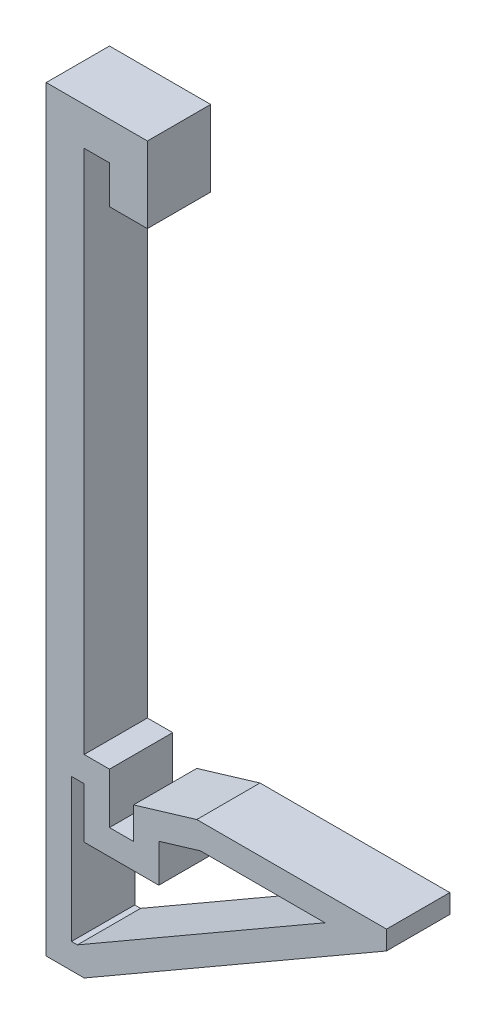
ISO-10303-21;
HEADER;
FILE_DESCRIPTION(('STEP AP214'),'2;1');
FILE_NAME('part.step','',(''),(''),'','','');
FILE_SCHEMA(('AUTOMOTIVE_DESIGN { 1 0 10303 214 1 1 1 1 }'));
ENDSEC;
DATA;
#1=APPLICATION_CONTEXT('core data for automotive mechanical design processes');
#2=APPLICATION_PROTOCOL_DEFINITION('international standard','automotive_design',2000,#1);
#3=PRODUCT_CONTEXT('',#1,'mechanical');
#4=PRODUCT('Part','Part','',(#3));
#5=PRODUCT_RELATED_PRODUCT_CATEGORY('part','',(#4));
#6=PRODUCT_DEFINITION_FORMATION('','',#4);
#7=PRODUCT_DEFINITION_CONTEXT('part definition',#1,'design');
#8=PRODUCT_DEFINITION('design','',#6,#7);
#9=PRODUCT_DEFINITION_SHAPE('','',#8);
#10=(LENGTH_UNIT() NAMED_UNIT(*) SI_UNIT(.MILLI.,.METRE.));
#11=(NAMED_UNIT(*) PLANE_ANGLE_UNIT() SI_UNIT($,.RADIAN.));
#12=(NAMED_UNIT(*) SI_UNIT($,.STERADIAN.) SOLID_ANGLE_UNIT());
#13=UNCERTAINTY_MEASURE_WITH_UNIT(LENGTH_MEASURE(1.E-05),#10,'distance_accuracy_value','');
#14=(GEOMETRIC_REPRESENTATION_CONTEXT(3) GLOBAL_UNCERTAINTY_ASSIGNED_CONTEXT((#13)) GLOBAL_UNIT_ASSIGNED_CONTEXT((#10,
#11,#12)) REPRESENTATION_CONTEXT('',''));
#15=CARTESIAN_POINT('',(0.,0.,0.));
#16=DIRECTION('',(0.,0.,1.));
#17=DIRECTION('',(1.,0.,0.));
#18=AXIS2_PLACEMENT_3D('',#15,#16,#17);
#19=CARTESIAN_POINT('',(0.,0.,5.));
#20=DIRECTION('',(1.15733016341672E-13,1.,0.));
#21=DIRECTION('',(-1.,1.15733016341672E-13,0.));
#22=AXIS2_PLACEMENT_3D('',#19,#20,#21);
#23=PLANE('',#22);
#24=DIRECTION('',(1.,-1.15733016341672E-13,0.));
#25=VECTOR('',#24,1.);
#26=CARTESIAN_POINT('',(0.,0.,0.));
#27=LINE('',#26,#25);
#28=CARTESIAN_POINT('',(0.,0.,0.));
#29=VERTEX_POINT('',#28);
#30=CARTESIAN_POINT('',(3.0000000000002,-3.47199049025038E-13,0.));
#31=VERTEX_POINT('',#30);
#32=EDGE_CURVE('E264',#29,#31,#27,.T.);
#33=ORIENTED_EDGE('',*,*,#32,.T.);
#34=DIRECTION('',(0.,0.,-1.));
#35=VECTOR('',#34,1.);
#36=CARTESIAN_POINT('',(3.0000000000002,-3.47199049025038E-13,5.));
#37=LINE('',#36,#35);
#38=CARTESIAN_POINT('',(3.0000000000002,-3.47199049025038E-13,5.));
#39=VERTEX_POINT('',#38);
#40=EDGE_CURVE('E11',#39,#31,#37,.T.);
#41=ORIENTED_EDGE('',*,*,#40,.F.);
#42=DIRECTION('',(1.,-1.15733016341672E-13,0.));
#43=VECTOR('',#42,1.);
#44=CARTESIAN_POINT('',(0.,0.,5.));
#45=LINE('',#44,#43);
#46=CARTESIAN_POINT('',(0.,0.,5.));
#47=VERTEX_POINT('',#46);
#48=EDGE_CURVE('E278',#47,#39,#45,.T.);
#49=ORIENTED_EDGE('',*,*,#48,.F.);
#50=DIRECTION('',(0.,0.,-1.));
#51=VECTOR('',#50,1.);
#52=CARTESIAN_POINT('',(0.,0.,5.));
#53=LINE('',#52,#51);
#54=EDGE_CURVE('E312',#47,#29,#53,.T.);
#55=ORIENTED_EDGE('',*,*,#54,.T.);
#56=EDGE_LOOP('',(#33,#41,#49,#55));
#57=FACE_BOUND('',#56,.T.);
#58=ADVANCED_FACE('F35',(#57),#23,.F.);
#59=CARTESIAN_POINT('',(3.0000000000002,-3.47199049025038E-13,5.));
#60=DIRECTION('',(-0.499999999999998,0.86602540378444,0.));
#61=DIRECTION('',(-0.86602540378444,-0.499999999999998,0.));
#62=AXIS2_PLACEMENT_3D('',#59,#60,#61);
#63=PLANE('',#62);
#64=DIRECTION('',(0.86602540378444,0.499999999999998,0.));
#65=VECTOR('',#64,1.);
#66=CARTESIAN_POINT('',(3.0000000000002,-3.47199049025038E-13,0.));
#67=LINE('',#66,#65);
#68=CARTESIAN_POINT('',(26.9000000000002,13.7986714336316,0.));
#69=VERTEX_POINT('',#68);
#70=EDGE_CURVE('E315',#31,#69,#67,.T.);
#71=ORIENTED_EDGE('',*,*,#70,.T.);
#72=DIRECTION('',(0.,0.,-1.));
#73=VECTOR('',#72,1.);
#74=CARTESIAN_POINT('',(26.9000000000002,13.7986714336316,5.));
#75=LINE('',#74,#73);
#76=CARTESIAN_POINT('',(26.9000000000002,13.7986714336316,5.));
#77=VERTEX_POINT('',#76);
#78=EDGE_CURVE('E42',#77,#69,#75,.T.);
#79=ORIENTED_EDGE('',*,*,#78,.F.);
#80=DIRECTION('',(0.86602540378444,0.499999999999998,0.));
#81=VECTOR('',#80,1.);
#82=CARTESIAN_POINT('',(3.0000000000002,-3.47199049025038E-13,5.));
#83=LINE('',#82,#81);
#84=EDGE_CURVE('E281',#39,#77,#83,.T.);
#85=ORIENTED_EDGE('',*,*,#84,.F.);
#86=ORIENTED_EDGE('',*,*,#40,.T.);
#87=EDGE_LOOP('',(#71,#79,#85,#86));
#88=FACE_BOUND('',#87,.T.);
#89=ADVANCED_FACE('F410',(#88),#63,.F.);
#90=CARTESIAN_POINT('',(26.9000000000002,15.2986714336316,5.));
#91=DIRECTION('',(-1.,0.,0.));
#92=DIRECTION('',(0.,-1.,0.));
#93=AXIS2_PLACEMENT_3D('',#90,#91,#92);
#94=PLANE('',#93);
#95=DIRECTION('',(0.,1.,0.));
#96=VECTOR('',#95,1.);
#97=CARTESIAN_POINT('',(26.9000000000002,15.2986714336316,0.));
#98=LINE('',#97,#96);
#99=CARTESIAN_POINT('',(26.9000000000002,15.2986714336316,0.));
#100=VERTEX_POINT('',#99);
#101=EDGE_CURVE('E317',#69,#100,#98,.T.);
#102=ORIENTED_EDGE('',*,*,#101,.T.);
#103=DIRECTION('',(0.,0.,-1.));
#104=VECTOR('',#103,1.);
#105=CARTESIAN_POINT('',(26.9000000000002,15.2986714336316,5.));
#106=LINE('',#105,#104);
#107=CARTESIAN_POINT('',(26.9000000000002,15.2986714336316,5.));
#108=VERTEX_POINT('',#107);
#109=EDGE_CURVE('E382',#108,#100,#106,.T.);
#110=ORIENTED_EDGE('',*,*,#109,.F.);
#111=DIRECTION('',(0.,1.,0.));
#112=VECTOR('',#111,1.);
#113=CARTESIAN_POINT('',(26.9000000000002,15.2986714336316,5.));
#114=LINE('',#113,#112);
#115=EDGE_CURVE('E284',#77,#108,#114,.T.);
#116=ORIENTED_EDGE('',*,*,#115,.F.);
#117=ORIENTED_EDGE('',*,*,#78,.T.);
#118=EDGE_LOOP('',(#102,#110,#116,#117));
#119=FACE_BOUND('',#118,.T.);
#120=ADVANCED_FACE('F389',(#119),#94,.F.);
#121=CARTESIAN_POINT('',(26.9000000000002,15.2986714336316,5.));
#122=DIRECTION('',(0.,-1.,0.));
#123=DIRECTION('',(1.,0.,0.));
#124=AXIS2_PLACEMENT_3D('',#121,#122,#123);
#125=PLANE('',#124);
#126=DIRECTION('',(-1.,0.,0.));
#127=VECTOR('',#126,1.);
#128=CARTESIAN_POINT('',(26.9000000000002,15.2986714336316,0.));
#129=LINE('',#128,#127);
#130=CARTESIAN_POINT('',(11.9000000000002,15.2986714336321,0.));
#131=VERTEX_POINT('',#130);
#132=EDGE_CURVE('E319',#100,#131,#129,.T.);
#133=ORIENTED_EDGE('',*,*,#132,.T.);
#134=DIRECTION('',(0.,0.,-1.));
#135=VECTOR('',#134,1.);
#136=CARTESIAN_POINT('',(11.9000000000002,15.2986714336321,5.));
#137=LINE('',#136,#135);
#138=CARTESIAN_POINT('',(11.9000000000002,15.2986714336321,5.));
#139=VERTEX_POINT('',#138);
#140=EDGE_CURVE('E379',#139,#131,#137,.T.);
#141=ORIENTED_EDGE('',*,*,#140,.F.);
#142=DIRECTION('',(-1.,0.,0.));
#143=VECTOR('',#142,1.);
#144=CARTESIAN_POINT('',(26.9000000000002,15.2986714336316,5.));
#145=LINE('',#144,#143);
#146=EDGE_CURVE('E286',#108,#139,#145,.T.);
#147=ORIENTED_EDGE('',*,*,#146,.F.);
#148=ORIENTED_EDGE('',*,*,#109,.T.);
#149=EDGE_LOOP('',(#133,#141,#147,#148));
#150=FACE_BOUND('',#149,.T.);
#151=ADVANCED_FACE('F398',(#150),#125,.F.);
#152=CARTESIAN_POINT('',(11.9000000000002,15.2986714336321,5.));
#153=DIRECTION('',(0.287347885566426,-0.957826285221127,0.));
#154=DIRECTION('',(0.957826285221127,0.287347885566426,0.));
#155=AXIS2_PLACEMENT_3D('',#152,#153,#154);
#156=PLANE('',#155);
#157=DIRECTION('',(-0.957826285221127,-0.287347885566426,0.));
#158=VECTOR('',#157,1.);
#159=CARTESIAN_POINT('',(11.9000000000002,15.2986714336321,0.));
#160=LINE('',#159,#158);
#161=CARTESIAN_POINT('',(6.90000000000019,13.7986714336316,0.));
#162=VERTEX_POINT('',#161);
#163=EDGE_CURVE('E321',#131,#162,#160,.T.);
#164=ORIENTED_EDGE('',*,*,#163,.T.);
#165=DIRECTION('',(0.,0.,-1.));
#166=VECTOR('',#165,1.);
#167=CARTESIAN_POINT('',(6.90000000000019,13.7986714336316,5.));
#168=LINE('',#167,#166);
#169=CARTESIAN_POINT('',(6.90000000000019,13.7986714336316,5.));
#170=VERTEX_POINT('',#169);
#171=EDGE_CURVE('E376',#170,#162,#168,.T.);
#172=ORIENTED_EDGE('',*,*,#171,.F.);
#173=DIRECTION('',(-0.957826285221127,-0.287347885566426,0.));
#174=VECTOR('',#173,1.);
#175=CARTESIAN_POINT('',(11.9000000000002,15.2986714336321,5.));
#176=LINE('',#175,#174);
#177=EDGE_CURVE('E288',#139,#170,#176,.T.);
#178=ORIENTED_EDGE('',*,*,#177,.F.);
#179=ORIENTED_EDGE('',*,*,#140,.T.);
#180=EDGE_LOOP('',(#164,#172,#178,#179));
#181=FACE_BOUND('',#180,.T.);
#182=ADVANCED_FACE('F402',(#181),#156,.F.);
#183=CARTESIAN_POINT('',(6.90000000000019,13.7986714336316,5.));
#184=DIRECTION('',(1.,0.,0.));
#185=DIRECTION('',(0.,0.,-1.));
#186=AXIS2_PLACEMENT_3D('',#183,#184,#185);
#187=PLANE('',#186);
#188=DIRECTION('',(0.,-1.,0.));
#189=VECTOR('',#188,1.);
#190=CARTESIAN_POINT('',(6.90000000000019,13.7986714336316,0.));
#191=LINE('',#190,#189);
#192=CARTESIAN_POINT('',(6.90000000000019,11.2986714336316,0.));
#193=VERTEX_POINT('',#192);
#194=EDGE_CURVE('E323',#162,#193,#191,.T.);
#195=ORIENTED_EDGE('',*,*,#194,.T.);
#196=DIRECTION('',(0.,0.,-1.));
#197=VECTOR('',#196,1.);
#198=CARTESIAN_POINT('',(6.90000000000019,11.2986714336316,5.));
#199=LINE('',#198,#197);
#200=CARTESIAN_POINT('',(6.90000000000019,11.2986714336316,5.));
#201=VERTEX_POINT('',#200);
#202=EDGE_CURVE('E373',#201,#193,#199,.T.);
#203=ORIENTED_EDGE('',*,*,#202,.F.);
#204=DIRECTION('',(0.,-1.,0.));
#205=VECTOR('',#204,1.);
#206=CARTESIAN_POINT('',(6.90000000000019,13.7986714336316,5.));
#207=LINE('',#206,#205);
#208=EDGE_CURVE('E290',#170,#201,#207,.T.);
#209=ORIENTED_EDGE('',*,*,#208,.F.);
#210=ORIENTED_EDGE('',*,*,#171,.T.);
#211=EDGE_LOOP('',(#195,#203,#209,#210));
#212=FACE_BOUND('',#211,.T.);
#213=ADVANCED_FACE('F463',(#212),#187,.F.);
#214=CARTESIAN_POINT('',(6.90000000000019,11.2986714336316,5.));
#215=DIRECTION('',(0.,-1.,0.));
#216=DIRECTION('',(0.,0.,-1.));
#217=AXIS2_PLACEMENT_3D('',#214,#215,#216);
#218=PLANE('',#217);
#219=DIRECTION('',(-1.,0.,0.));
#220=VECTOR('',#219,1.);
#221=CARTESIAN_POINT('',(6.90000000000019,11.2986714336316,0.));
#222=LINE('',#221,#220);
#223=CARTESIAN_POINT('',(5.00000000000019,11.2986714336316,0.));
#224=VERTEX_POINT('',#223);
#225=EDGE_CURVE('E325',#193,#224,#222,.T.);
#226=ORIENTED_EDGE('',*,*,#225,.T.);
#227=DIRECTION('',(0.,0.,-1.));
#228=VECTOR('',#227,1.);
#229=CARTESIAN_POINT('',(5.00000000000019,11.2986714336316,5.));
#230=LINE('',#229,#228);
#231=CARTESIAN_POINT('',(5.00000000000019,11.2986714336316,5.));
#232=VERTEX_POINT('',#231);
#233=EDGE_CURVE('E370',#232,#224,#230,.T.);
#234=ORIENTED_EDGE('',*,*,#233,.F.);
#235=DIRECTION('',(-1.,0.,0.));
#236=VECTOR('',#235,1.);
#237=CARTESIAN_POINT('',(6.90000000000019,11.2986714336316,5.));
#238=LINE('',#237,#236);
#239=EDGE_CURVE('E292',#201,#232,#238,.T.);
#240=ORIENTED_EDGE('',*,*,#239,.F.);
#241=ORIENTED_EDGE('',*,*,#202,.T.);
#242=EDGE_LOOP('',(#226,#234,#240,#241));
#243=FACE_BOUND('',#242,.T.);
#244=ADVANCED_FACE('F460',(#243),#218,.F.);
#245=CARTESIAN_POINT('',(5.00000000000019,11.2986714336316,5.));
#246=DIRECTION('',(-1.,0.,0.));
#247=DIRECTION('',(0.,0.,1.));
#248=AXIS2_PLACEMENT_3D('',#245,#246,#247);
#249=PLANE('',#248);
#250=DIRECTION('',(0.,1.,0.));
#251=VECTOR('',#250,1.);
#252=CARTESIAN_POINT('',(5.00000000000019,11.2986714336316,0.));
#253=LINE('',#252,#251);
#254=CARTESIAN_POINT('',(5.00000000000019,15.2986714336316,0.));
#255=VERTEX_POINT('',#254);
#256=EDGE_CURVE('E327',#224,#255,#253,.T.);
#257=ORIENTED_EDGE('',*,*,#256,.T.);
#258=DIRECTION('',(0.,0.,-1.));
#259=VECTOR('',#258,1.);
#260=CARTESIAN_POINT('',(5.00000000000019,15.2986714336316,5.));
#261=LINE('',#260,#259);
#262=CARTESIAN_POINT('',(5.00000000000019,15.2986714336316,5.));
#263=VERTEX_POINT('',#262);
#264=EDGE_CURVE('E367',#263,#255,#261,.T.);
#265=ORIENTED_EDGE('',*,*,#264,.F.);
#266=DIRECTION('',(0.,1.,0.));
#267=VECTOR('',#266,1.);
#268=CARTESIAN_POINT('',(5.00000000000019,11.2986714336316,5.));
#269=LINE('',#268,#267);
#270=EDGE_CURVE('E294',#232,#263,#269,.T.);
#271=ORIENTED_EDGE('',*,*,#270,.F.);
#272=ORIENTED_EDGE('',*,*,#233,.T.);
#273=EDGE_LOOP('',(#257,#265,#271,#272));
#274=FACE_BOUND('',#273,.T.);
#275=ADVANCED_FACE('F456',(#274),#249,.F.);
#276=CARTESIAN_POINT('',(5.00000000000019,15.2986714336316,5.));
#277=DIRECTION('',(0.,-1.,0.));
#278=DIRECTION('',(1.,0.,0.));
#279=AXIS2_PLACEMENT_3D('',#276,#277,#278);
#280=PLANE('',#279);
#281=DIRECTION('',(-1.,0.,0.));
#282=VECTOR('',#281,1.);
#283=CARTESIAN_POINT('',(5.00000000000019,15.2986714336316,0.));
#284=LINE('',#283,#282);
#285=CARTESIAN_POINT('',(3.00000000000019,15.2986714336316,0.));
#286=VERTEX_POINT('',#285);
#287=EDGE_CURVE('E329',#255,#286,#284,.T.);
#288=ORIENTED_EDGE('',*,*,#287,.T.);
#289=DIRECTION('',(0.,0.,-1.));
#290=VECTOR('',#289,1.);
#291=CARTESIAN_POINT('',(3.00000000000019,15.2986714336316,5.));
#292=LINE('',#291,#290);
#293=CARTESIAN_POINT('',(3.00000000000019,15.2986714336316,5.));
#294=VERTEX_POINT('',#293);
#295=EDGE_CURVE('E364',#294,#286,#292,.T.);
#296=ORIENTED_EDGE('',*,*,#295,.F.);
#297=DIRECTION('',(-1.,0.,0.));
#298=VECTOR('',#297,1.);
#299=CARTESIAN_POINT('',(5.00000000000019,15.2986714336316,5.));
#300=LINE('',#299,#298);
#301=EDGE_CURVE('E296',#263,#294,#300,.T.);
#302=ORIENTED_EDGE('',*,*,#301,.F.);
#303=ORIENTED_EDGE('',*,*,#264,.T.);
#304=EDGE_LOOP('',(#288,#296,#302,#303));
#305=FACE_BOUND('',#304,.T.);
#306=ADVANCED_FACE('F452',(#305),#280,.F.);
#307=CARTESIAN_POINT('',(3.00000000000019,56.7986714336316,5.));
#308=DIRECTION('',(-1.,0.,0.));
#309=DIRECTION('',(0.,-1.,0.));
#310=AXIS2_PLACEMENT_3D('',#307,#308,#309);
#311=PLANE('',#310);
#312=DIRECTION('',(0.,1.,0.));
#313=VECTOR('',#312,1.);
#314=CARTESIAN_POINT('',(3.00000000000019,56.7986714336316,0.));
#315=LINE('',#314,#313);
#316=CARTESIAN_POINT('',(3.00000000000019,56.7986714336316,0.));
#317=VERTEX_POINT('',#316);
#318=EDGE_CURVE('E331',#286,#317,#315,.T.);
#319=ORIENTED_EDGE('',*,*,#318,.T.);
#320=DIRECTION('',(0.,0.,-1.));
#321=VECTOR('',#320,1.);
#322=CARTESIAN_POINT('',(3.00000000000019,56.7986714336316,5.));
#323=LINE('',#322,#321);
#324=CARTESIAN_POINT('',(3.00000000000019,56.7986714336316,5.));
#325=VERTEX_POINT('',#324);
#326=EDGE_CURVE('E361',#325,#317,#323,.T.);
#327=ORIENTED_EDGE('',*,*,#326,.F.);
#328=DIRECTION('',(0.,1.,0.));
#329=VECTOR('',#328,1.);
#330=CARTESIAN_POINT('',(3.00000000000019,56.7986714336316,5.));
#331=LINE('',#330,#329);
#332=EDGE_CURVE('E298',#294,#325,#331,.T.);
#333=ORIENTED_EDGE('',*,*,#332,.F.);
#334=ORIENTED_EDGE('',*,*,#295,.T.);
#335=EDGE_LOOP('',(#319,#327,#333,#334));
#336=FACE_BOUND('',#335,.T.);
#337=ADVANCED_FACE('F447',(#336),#311,.F.);
#338=CARTESIAN_POINT('',(5.00000000000019,56.7986714336316,5.));
#339=DIRECTION('',(0.,1.,0.));
#340=DIRECTION('',(0.,0.,1.));
#341=AXIS2_PLACEMENT_3D('',#338,#339,#340);
#342=PLANE('',#341);
#343=DIRECTION('',(1.,0.,0.));
#344=VECTOR('',#343,1.);
#345=CARTESIAN_POINT('',(5.00000000000019,56.7986714336316,0.));
#346=LINE('',#345,#344);
#347=CARTESIAN_POINT('',(5.00000000000019,56.7986714336316,0.));
#348=VERTEX_POINT('',#347);
#349=EDGE_CURVE('E333',#317,#348,#346,.T.);
#350=ORIENTED_EDGE('',*,*,#349,.T.);
#351=DIRECTION('',(0.,0.,-1.));
#352=VECTOR('',#351,1.);
#353=CARTESIAN_POINT('',(5.00000000000019,56.7986714336316,5.));
#354=LINE('',#353,#352);
#355=CARTESIAN_POINT('',(5.00000000000019,56.7986714336316,5.));
#356=VERTEX_POINT('',#355);
#357=EDGE_CURVE('E358',#356,#348,#354,.T.);
#358=ORIENTED_EDGE('',*,*,#357,.F.);
#359=DIRECTION('',(1.,0.,0.));
#360=VECTOR('',#359,1.);
#361=CARTESIAN_POINT('',(5.00000000000019,56.7986714336316,5.));
#362=LINE('',#361,#360);
#363=EDGE_CURVE('E300',#325,#356,#362,.T.);
#364=ORIENTED_EDGE('',*,*,#363,.F.);
#365=ORIENTED_EDGE('',*,*,#326,.T.);
#366=EDGE_LOOP('',(#350,#358,#364,#365));
#367=FACE_BOUND('',#366,.T.);
#368=ADVANCED_FACE('F441',(#367),#342,.F.);
#369=CARTESIAN_POINT('',(5.00000000000019,53.7986714336316,5.));
#370=DIRECTION('',(1.,0.,0.));
#371=DIRECTION('',(0.,0.,-1.));
#372=AXIS2_PLACEMENT_3D('',#369,#370,#371);
#373=PLANE('',#372);
#374=DIRECTION('',(0.,-1.,0.));
#375=VECTOR('',#374,1.);
#376=CARTESIAN_POINT('',(5.00000000000019,53.7986714336316,0.));
#377=LINE('',#376,#375);
#378=CARTESIAN_POINT('',(5.00000000000019,53.7986714336316,0.));
#379=VERTEX_POINT('',#378);
#380=EDGE_CURVE('E335',#348,#379,#377,.T.);
#381=ORIENTED_EDGE('',*,*,#380,.T.);
#382=DIRECTION('',(0.,0.,-1.));
#383=VECTOR('',#382,1.);
#384=CARTESIAN_POINT('',(5.00000000000019,53.7986714336316,5.));
#385=LINE('',#384,#383);
#386=CARTESIAN_POINT('',(5.00000000000019,53.7986714336316,5.));
#387=VERTEX_POINT('',#386);
#388=EDGE_CURVE('E355',#387,#379,#385,.T.);
#389=ORIENTED_EDGE('',*,*,#388,.F.);
#390=DIRECTION('',(0.,-1.,0.));
#391=VECTOR('',#390,1.);
#392=CARTESIAN_POINT('',(5.00000000000019,53.7986714336316,5.));
#393=LINE('',#392,#391);
#394=EDGE_CURVE('E302',#356,#387,#393,.T.);
#395=ORIENTED_EDGE('',*,*,#394,.F.);
#396=ORIENTED_EDGE('',*,*,#357,.T.);
#397=EDGE_LOOP('',(#381,#389,#395,#396));
#398=FACE_BOUND('',#397,.T.);
#399=ADVANCED_FACE('F437',(#398),#373,.F.);
#400=CARTESIAN_POINT('',(8.00000000000019,53.7986714336316,5.));
#401=DIRECTION('',(0.,1.,0.));
#402=DIRECTION('',(0.,0.,1.));
#403=AXIS2_PLACEMENT_3D('',#400,#401,#402);
#404=PLANE('',#403);
#405=DIRECTION('',(1.,0.,0.));
#406=VECTOR('',#405,1.);
#407=CARTESIAN_POINT('',(8.00000000000019,53.7986714336316,0.));
#408=LINE('',#407,#406);
#409=CARTESIAN_POINT('',(8.00000000000019,53.7986714336316,0.));
#410=VERTEX_POINT('',#409);
#411=EDGE_CURVE('E337',#379,#410,#408,.T.);
#412=ORIENTED_EDGE('',*,*,#411,.T.);
#413=DIRECTION('',(0.,0.,-1.));
#414=VECTOR('',#413,1.);
#415=CARTESIAN_POINT('',(8.00000000000019,53.7986714336316,5.));
#416=LINE('',#415,#414);
#417=CARTESIAN_POINT('',(8.00000000000019,53.7986714336316,5.));
#418=VERTEX_POINT('',#417);
#419=EDGE_CURVE('E352',#418,#410,#416,.T.);
#420=ORIENTED_EDGE('',*,*,#419,.F.);
#421=DIRECTION('',(1.,0.,0.));
#422=VECTOR('',#421,1.);
#423=CARTESIAN_POINT('',(8.00000000000019,53.7986714336316,5.));
#424=LINE('',#423,#422);
#425=EDGE_CURVE('E304',#387,#418,#424,.T.);
#426=ORIENTED_EDGE('',*,*,#425,.F.);
#427=ORIENTED_EDGE('',*,*,#388,.T.);
#428=EDGE_LOOP('',(#412,#420,#426,#427));
#429=FACE_BOUND('',#428,.T.);
#430=ADVANCED_FACE('F432',(#429),#404,.F.);
#431=CARTESIAN_POINT('',(8.00000000000019,59.7986714336316,5.));
#432=DIRECTION('',(-1.,0.,0.));
#433=DIRECTION('',(0.,0.,1.));
#434=AXIS2_PLACEMENT_3D('',#431,#432,#433);
#435=PLANE('',#434);
#436=DIRECTION('',(0.,1.,0.));
#437=VECTOR('',#436,1.);
#438=CARTESIAN_POINT('',(8.00000000000019,59.7986714336316,0.));
#439=LINE('',#438,#437);
#440=CARTESIAN_POINT('',(8.00000000000019,59.7986714336316,0.));
#441=VERTEX_POINT('',#440);
#442=EDGE_CURVE('E339',#410,#441,#439,.T.);
#443=ORIENTED_EDGE('',*,*,#442,.T.);
#444=DIRECTION('',(0.,0.,-1.));
#445=VECTOR('',#444,1.);
#446=CARTESIAN_POINT('',(8.00000000000019,59.7986714336316,5.));
#447=LINE('',#446,#445);
#448=CARTESIAN_POINT('',(8.00000000000019,59.7986714336316,5.));
#449=VERTEX_POINT('',#448);
#450=EDGE_CURVE('E349',#449,#441,#447,.T.);
#451=ORIENTED_EDGE('',*,*,#450,.F.);
#452=DIRECTION('',(0.,1.,0.));
#453=VECTOR('',#452,1.);
#454=CARTESIAN_POINT('',(8.00000000000019,59.7986714336316,5.));
#455=LINE('',#454,#453);
#456=EDGE_CURVE('E306',#418,#449,#455,.T.);
#457=ORIENTED_EDGE('',*,*,#456,.F.);
#458=ORIENTED_EDGE('',*,*,#419,.T.);
#459=EDGE_LOOP('',(#443,#451,#457,#458));
#460=FACE_BOUND('',#459,.T.);
#461=ADVANCED_FACE('F426',(#460),#435,.F.);
#462=CARTESIAN_POINT('',(0.,59.7986714336316,5.));
#463=DIRECTION('',(0.,-1.,0.));
#464=DIRECTION('',(0.,0.,-1.));
#465=AXIS2_PLACEMENT_3D('',#462,#463,#464);
#466=PLANE('',#465);
#467=DIRECTION('',(-1.,0.,0.));
#468=VECTOR('',#467,1.);
#469=CARTESIAN_POINT('',(0.,59.7986714336316,0.));
#470=LINE('',#469,#468);
#471=CARTESIAN_POINT('',(0.,59.7986714336316,0.));
#472=VERTEX_POINT('',#471);
#473=EDGE_CURVE('E341',#441,#472,#470,.T.);
#474=ORIENTED_EDGE('',*,*,#473,.T.);
#475=DIRECTION('',(0.,0.,-1.));
#476=VECTOR('',#475,1.);
#477=CARTESIAN_POINT('',(0.,59.7986714336316,5.));
#478=LINE('',#477,#476);
#479=CARTESIAN_POINT('',(0.,59.7986714336316,5.));
#480=VERTEX_POINT('',#479);
#481=EDGE_CURVE('E346',#480,#472,#478,.T.);
#482=ORIENTED_EDGE('',*,*,#481,.F.);
#483=DIRECTION('',(-1.,0.,0.));
#484=VECTOR('',#483,1.);
#485=CARTESIAN_POINT('',(0.,59.7986714336316,5.));
#486=LINE('',#485,#484);
#487=EDGE_CURVE('E308',#449,#480,#486,.T.);
#488=ORIENTED_EDGE('',*,*,#487,.F.);
#489=ORIENTED_EDGE('',*,*,#450,.T.);
#490=EDGE_LOOP('',(#474,#482,#488,#489));
#491=FACE_BOUND('',#490,.T.);
#492=ADVANCED_FACE('F422',(#491),#466,.F.);
#493=CARTESIAN_POINT('',(0.,0.,5.));
#494=DIRECTION('',(1.,0.,0.));
#495=DIRECTION('',(0.,0.,-1.));
#496=AXIS2_PLACEMENT_3D('',#493,#494,#495);
#497=PLANE('',#496);
#498=DIRECTION('',(0.,-1.,0.));
#499=VECTOR('',#498,1.);
#500=CARTESIAN_POINT('',(0.,0.,0.));
#501=LINE('',#500,#499);
#502=EDGE_CURVE('E282',#472,#29,#501,.T.);
#503=ORIENTED_EDGE('',*,*,#502,.T.);
#504=ORIENTED_EDGE('',*,*,#54,.F.);
#505=DIRECTION('',(0.,-1.,0.));
#506=VECTOR('',#505,1.);
#507=CARTESIAN_POINT('',(0.,0.,5.));
#508=LINE('',#507,#506);
#509=EDGE_CURVE('E310',#480,#47,#508,.T.);
#510=ORIENTED_EDGE('',*,*,#509,.F.);
#511=ORIENTED_EDGE('',*,*,#481,.T.);
#512=EDGE_LOOP('',(#503,#504,#510,#511));
#513=FACE_BOUND('',#512,.T.);
#514=ADVANCED_FACE('F417',(#513),#497,.F.);
#515=CARTESIAN_POINT('',(0.,0.,5.));
#516=DIRECTION('',(0.,0.,-1.));
#517=DIRECTION('',(-1.,0.,0.));
#518=AXIS2_PLACEMENT_3D('',#515,#516,#517);
#519=PLANE('',#518);
#520=DIRECTION('',(1.,0.,0.));
#521=VECTOR('',#520,1.);
#522=CARTESIAN_POINT('',(2.,1.99999999999995,5.));
#523=LINE('',#522,#521);
#524=CARTESIAN_POINT('',(2.,1.99999999999995,5.));
#525=VERTEX_POINT('',#524);
#526=CARTESIAN_POINT('',(2.46410161513785,1.99999999999992,5.));
#527=VERTEX_POINT('',#526);
#528=EDGE_CURVE('E243',#525,#527,#523,.T.);
#529=ORIENTED_EDGE('',*,*,#528,.F.);
#530=DIRECTION('',(0.,-1.,0.));
#531=VECTOR('',#530,1.);
#532=CARTESIAN_POINT('',(2.,13.2986714336316,5.));
#533=LINE('',#532,#531);
#534=CARTESIAN_POINT('',(2.,13.2986714336316,5.));
#535=VERTEX_POINT('',#534);
#536=EDGE_CURVE('E49',#535,#525,#533,.T.);
#537=ORIENTED_EDGE('',*,*,#536,.F.);
#538=DIRECTION('',(-1.,0.,0.));
#539=VECTOR('',#538,1.);
#540=CARTESIAN_POINT('',(3.00000000000019,13.2986714336316,5.));
#541=LINE('',#540,#539);
#542=CARTESIAN_POINT('',(3.00000000000019,13.2986714336316,5.));
#543=VERTEX_POINT('',#542);
#544=EDGE_CURVE('E220',#543,#535,#541,.T.);
#545=ORIENTED_EDGE('',*,*,#544,.F.);
#546=DIRECTION('',(0.,1.,0.));
#547=VECTOR('',#546,1.);
#548=CARTESIAN_POINT('',(3.00000000000019,9.29867143363164,5.));
#549=LINE('',#548,#547);
#550=CARTESIAN_POINT('',(3.00000000000019,9.29867143363164,5.));
#551=VERTEX_POINT('',#550);
#552=EDGE_CURVE('E223',#551,#543,#549,.T.);
#553=ORIENTED_EDGE('',*,*,#552,.F.);
#554=DIRECTION('',(-1.,0.,0.));
#555=VECTOR('',#554,1.);
#556=CARTESIAN_POINT('',(8.90000000000019,9.29867143363164,5.));
#557=LINE('',#556,#555);
#558=CARTESIAN_POINT('',(8.90000000000019,9.29867143363164,5.));
#559=VERTEX_POINT('',#558);
#560=EDGE_CURVE('E257',#559,#551,#557,.T.);
#561=ORIENTED_EDGE('',*,*,#560,.F.);
#562=DIRECTION('',(0.,-1.,0.));
#563=VECTOR('',#562,1.);
#564=CARTESIAN_POINT('',(8.90000000000019,12.3106101318497,5.));
#565=LINE('',#564,#563);
#566=CARTESIAN_POINT('',(8.90000000000019,12.3106101318497,5.));
#567=VERTEX_POINT('',#566);
#568=EDGE_CURVE('E254',#567,#559,#565,.T.);
#569=ORIENTED_EDGE('',*,*,#568,.F.);
#570=DIRECTION('',(-0.957826285221127,-0.287347885566426,0.));
#571=VECTOR('',#570,1.);
#572=CARTESIAN_POINT('',(12.1935376726073,13.2986714336321,5.));
#573=LINE('',#572,#571);
#574=CARTESIAN_POINT('',(12.1935376726073,13.2986714336321,5.));
#575=VERTEX_POINT('',#574);
#576=EDGE_CURVE('E251',#575,#567,#573,.T.);
#577=ORIENTED_EDGE('',*,*,#576,.F.);
#578=DIRECTION('',(-1.,0.,0.));
#579=VECTOR('',#578,1.);
#580=CARTESIAN_POINT('',(22.033974596216,13.2986714336318,5.));
#581=LINE('',#580,#579);
#582=CARTESIAN_POINT('',(22.033974596216,13.2986714336318,5.));
#583=VERTEX_POINT('',#582);
#584=EDGE_CURVE('E248',#583,#575,#581,.T.);
#585=ORIENTED_EDGE('',*,*,#584,.F.);
#586=DIRECTION('',(0.866025403784446,0.499999999999987,0.));
#587=VECTOR('',#586,1.);
#588=CARTESIAN_POINT('',(2.46410161513785,1.99999999999992,5.));
#589=LINE('',#588,#587);
#590=EDGE_CURVE('E245',#527,#583,#589,.T.);
#591=ORIENTED_EDGE('',*,*,#590,.F.);
#592=EDGE_LOOP('',(#529,#537,#545,#553,#561,#569,#577,#585,#591));
#593=FACE_BOUND('',#592,.T.);
#594=ORIENTED_EDGE('',*,*,#48,.T.);
#595=ORIENTED_EDGE('',*,*,#84,.T.);
#596=ORIENTED_EDGE('',*,*,#115,.T.);
#597=ORIENTED_EDGE('',*,*,#146,.T.);
#598=ORIENTED_EDGE('',*,*,#177,.T.);
#599=ORIENTED_EDGE('',*,*,#208,.T.);
#600=ORIENTED_EDGE('',*,*,#239,.T.);
#601=ORIENTED_EDGE('',*,*,#270,.T.);
#602=ORIENTED_EDGE('',*,*,#301,.T.);
#603=ORIENTED_EDGE('',*,*,#332,.T.);
#604=ORIENTED_EDGE('',*,*,#363,.T.);
#605=ORIENTED_EDGE('',*,*,#394,.T.);
#606=ORIENTED_EDGE('',*,*,#425,.T.);
#607=ORIENTED_EDGE('',*,*,#456,.T.);
#608=ORIENTED_EDGE('',*,*,#487,.T.);
#609=ORIENTED_EDGE('',*,*,#509,.T.);
#610=EDGE_LOOP('',(#594,#595,#596,#597,#598,#599,#600,#601,#602,#603,#604,#605,#606,#607,#608,#609));
#611=FACE_BOUND('',#610,.T.);
#612=ADVANCED_FACE('F406',(#593,#611),#519,.F.);
#613=CARTESIAN_POINT('',(0.,0.,0.));
#614=DIRECTION('',(0.,0.,-1.));
#615=DIRECTION('',(-1.,0.,0.));
#616=AXIS2_PLACEMENT_3D('',#613,#614,#615);
#617=PLANE('',#616);
#618=DIRECTION('',(0.,-1.,0.));
#619=VECTOR('',#618,1.);
#620=CARTESIAN_POINT('',(2.,13.2986714336316,0.));
#621=LINE('',#620,#619);
#622=CARTESIAN_POINT('',(2.,13.2986714336316,0.));
#623=VERTEX_POINT('',#622);
#624=CARTESIAN_POINT('',(2.,1.99999999999995,0.));
#625=VERTEX_POINT('',#624);
#626=EDGE_CURVE('E203',#623,#625,#621,.T.);
#627=ORIENTED_EDGE('',*,*,#626,.T.);
#628=DIRECTION('',(1.,0.,0.));
#629=VECTOR('',#628,1.);
#630=CARTESIAN_POINT('',(2.,1.99999999999995,0.));
#631=LINE('',#630,#629);
#632=CARTESIAN_POINT('',(2.46410161513785,1.99999999999992,0.));
#633=VERTEX_POINT('',#632);
#634=EDGE_CURVE('E212',#625,#633,#631,.T.);
#635=ORIENTED_EDGE('',*,*,#634,.T.);
#636=DIRECTION('',(0.866025403784446,0.499999999999987,0.));
#637=VECTOR('',#636,1.);
#638=CARTESIAN_POINT('',(2.46410161513785,1.99999999999992,0.));
#639=LINE('',#638,#637);
#640=CARTESIAN_POINT('',(22.033974596216,13.2986714336318,0.));
#641=VERTEX_POINT('',#640);
#642=EDGE_CURVE('E57',#633,#641,#639,.T.);
#643=ORIENTED_EDGE('',*,*,#642,.T.);
#644=DIRECTION('',(-1.,0.,0.));
#645=VECTOR('',#644,1.);
#646=CARTESIAN_POINT('',(22.033974596216,13.2986714336318,0.));
#647=LINE('',#646,#645);
#648=CARTESIAN_POINT('',(12.1935376726073,13.2986714336321,0.));
#649=VERTEX_POINT('',#648);
#650=EDGE_CURVE('E227',#641,#649,#647,.T.);
#651=ORIENTED_EDGE('',*,*,#650,.T.);
#652=DIRECTION('',(-0.957826285221127,-0.287347885566426,0.));
#653=VECTOR('',#652,1.);
#654=CARTESIAN_POINT('',(12.1935376726073,13.2986714336321,0.));
#655=LINE('',#654,#653);
#656=CARTESIAN_POINT('',(8.90000000000019,12.3106101318497,0.));
#657=VERTEX_POINT('',#656);
#658=EDGE_CURVE('E230',#649,#657,#655,.T.);
#659=ORIENTED_EDGE('',*,*,#658,.T.);
#660=DIRECTION('',(0.,-1.,0.));
#661=VECTOR('',#660,1.);
#662=CARTESIAN_POINT('',(8.90000000000019,12.3106101318497,0.));
#663=LINE('',#662,#661);
#664=CARTESIAN_POINT('',(8.90000000000019,9.29867143363164,0.));
#665=VERTEX_POINT('',#664);
#666=EDGE_CURVE('E233',#657,#665,#663,.T.);
#667=ORIENTED_EDGE('',*,*,#666,.T.);
#668=DIRECTION('',(-1.,0.,0.));
#669=VECTOR('',#668,1.);
#670=CARTESIAN_POINT('',(8.90000000000019,9.29867143363164,0.));
#671=LINE('',#670,#669);
#672=CARTESIAN_POINT('',(3.00000000000019,9.29867143363164,0.));
#673=VERTEX_POINT('',#672);
#674=EDGE_CURVE('E236',#665,#673,#671,.T.);
#675=ORIENTED_EDGE('',*,*,#674,.T.);
#676=DIRECTION('',(0.,1.,0.));
#677=VECTOR('',#676,1.);
#678=CARTESIAN_POINT('',(3.00000000000019,9.29867143363164,0.));
#679=LINE('',#678,#677);
#680=CARTESIAN_POINT('',(3.00000000000019,13.2986714336316,0.));
#681=VERTEX_POINT('',#680);
#682=EDGE_CURVE('E239',#673,#681,#679,.T.);
#683=ORIENTED_EDGE('',*,*,#682,.T.);
#684=DIRECTION('',(-1.,0.,0.));
#685=VECTOR('',#684,1.);
#686=CARTESIAN_POINT('',(3.00000000000019,13.2986714336316,0.));
#687=LINE('',#686,#685);
#688=EDGE_CURVE('E209',#681,#623,#687,.T.);
#689=ORIENTED_EDGE('',*,*,#688,.T.);
#690=EDGE_LOOP('',(#627,#635,#643,#651,#659,#667,#675,#683,#689));
#691=FACE_BOUND('',#690,.T.);
#692=ORIENTED_EDGE('',*,*,#32,.F.);
#693=ORIENTED_EDGE('',*,*,#502,.F.);
#694=ORIENTED_EDGE('',*,*,#473,.F.);
#695=ORIENTED_EDGE('',*,*,#442,.F.);
#696=ORIENTED_EDGE('',*,*,#411,.F.);
#697=ORIENTED_EDGE('',*,*,#380,.F.);
#698=ORIENTED_EDGE('',*,*,#349,.F.);
#699=ORIENTED_EDGE('',*,*,#318,.F.);
#700=ORIENTED_EDGE('',*,*,#287,.F.);
#701=ORIENTED_EDGE('',*,*,#256,.F.);
#702=ORIENTED_EDGE('',*,*,#225,.F.);
#703=ORIENTED_EDGE('',*,*,#194,.F.);
#704=ORIENTED_EDGE('',*,*,#163,.F.);
#705=ORIENTED_EDGE('',*,*,#132,.F.);
#706=ORIENTED_EDGE('',*,*,#101,.F.);
#707=ORIENTED_EDGE('',*,*,#70,.F.);
#708=EDGE_LOOP('',(#692,#693,#694,#695,#696,#697,#698,#699,#700,#701,#702,#703,#704,#705,#706,#707));
#709=FACE_BOUND('',#708,.T.);
#710=ADVANCED_FACE('F216',(#691,#709),#617,.T.);
#711=CARTESIAN_POINT('',(2.,13.2986714336316,0.));
#712=DIRECTION('',(-1.,0.,0.));
#713=DIRECTION('',(0.,0.,1.));
#714=AXIS2_PLACEMENT_3D('',#711,#712,#713);
#715=PLANE('',#714);
#716=ORIENTED_EDGE('',*,*,#536,.T.);
#717=DIRECTION('',(0.,0.,1.));
#718=VECTOR('',#717,1.);
#719=CARTESIAN_POINT('',(2.,1.99999999999995,0.));
#720=LINE('',#719,#718);
#721=EDGE_CURVE('E199',#625,#525,#720,.T.);
#722=ORIENTED_EDGE('',*,*,#721,.F.);
#723=ORIENTED_EDGE('',*,*,#626,.F.);
#724=DIRECTION('',(0.,0.,1.));
#725=VECTOR('',#724,1.);
#726=CARTESIAN_POINT('',(2.,13.2986714336316,0.));
#727=LINE('',#726,#725);
#728=EDGE_CURVE('E262',#623,#535,#727,.T.);
#729=ORIENTED_EDGE('',*,*,#728,.T.);
#730=EDGE_LOOP('',(#716,#722,#723,#729));
#731=FACE_BOUND('',#730,.T.);
#732=ADVANCED_FACE('F201',(#731),#715,.F.);
#733=CARTESIAN_POINT('',(3.00000000000019,13.2986714336316,0.));
#734=DIRECTION('',(0.,1.,0.));
#735=DIRECTION('',(-1.,0.,0.));
#736=AXIS2_PLACEMENT_3D('',#733,#734,#735);
#737=PLANE('',#736);
#738=ORIENTED_EDGE('',*,*,#544,.T.);
#739=ORIENTED_EDGE('',*,*,#728,.F.);
#740=ORIENTED_EDGE('',*,*,#688,.F.);
#741=DIRECTION('',(0.,0.,1.));
#742=VECTOR('',#741,1.);
#743=CARTESIAN_POINT('',(3.00000000000019,13.2986714336316,0.));
#744=LINE('',#743,#742);
#745=EDGE_CURVE('E265',#681,#543,#744,.T.);
#746=ORIENTED_EDGE('',*,*,#745,.T.);
#747=EDGE_LOOP('',(#738,#739,#740,#746));
#748=FACE_BOUND('',#747,.T.);
#749=ADVANCED_FACE('F598',(#748),#737,.F.);
#750=CARTESIAN_POINT('',(3.00000000000019,9.29867143363164,0.));
#751=DIRECTION('',(1.,0.,0.));
#752=DIRECTION('',(0.,0.,-1.));
#753=AXIS2_PLACEMENT_3D('',#750,#751,#752);
#754=PLANE('',#753);
#755=ORIENTED_EDGE('',*,*,#552,.T.);
#756=ORIENTED_EDGE('',*,*,#745,.F.);
#757=ORIENTED_EDGE('',*,*,#682,.F.);
#758=DIRECTION('',(0.,0.,1.));
#759=VECTOR('',#758,1.);
#760=CARTESIAN_POINT('',(3.00000000000019,9.29867143363164,0.));
#761=LINE('',#760,#759);
#762=EDGE_CURVE('E267',#673,#551,#761,.T.);
#763=ORIENTED_EDGE('',*,*,#762,.T.);
#764=EDGE_LOOP('',(#755,#756,#757,#763));
#765=FACE_BOUND('',#764,.T.);
#766=ADVANCED_FACE('F607',(#765),#754,.F.);
#767=CARTESIAN_POINT('',(8.90000000000019,9.29867143363164,0.));
#768=DIRECTION('',(0.,1.,0.));
#769=DIRECTION('',(0.,0.,1.));
#770=AXIS2_PLACEMENT_3D('',#767,#768,#769);
#771=PLANE('',#770);
#772=ORIENTED_EDGE('',*,*,#560,.T.);
#773=ORIENTED_EDGE('',*,*,#762,.F.);
#774=ORIENTED_EDGE('',*,*,#674,.F.);
#775=DIRECTION('',(0.,0.,1.));
#776=VECTOR('',#775,1.);
#777=CARTESIAN_POINT('',(8.90000000000019,9.29867143363164,0.));
#778=LINE('',#777,#776);
#779=EDGE_CURVE('E269',#665,#559,#778,.T.);
#780=ORIENTED_EDGE('',*,*,#779,.T.);
#781=EDGE_LOOP('',(#772,#773,#774,#780));
#782=FACE_BOUND('',#781,.T.);
#783=ADVANCED_FACE('F617',(#782),#771,.F.);
#784=CARTESIAN_POINT('',(8.90000000000019,12.3106101318497,0.));
#785=DIRECTION('',(-1.,0.,0.));
#786=DIRECTION('',(0.,0.,1.));
#787=AXIS2_PLACEMENT_3D('',#784,#785,#786);
#788=PLANE('',#787);
#789=ORIENTED_EDGE('',*,*,#568,.T.);
#790=ORIENTED_EDGE('',*,*,#779,.F.);
#791=ORIENTED_EDGE('',*,*,#666,.F.);
#792=DIRECTION('',(0.,0.,1.));
#793=VECTOR('',#792,1.);
#794=CARTESIAN_POINT('',(8.90000000000019,12.3106101318497,0.));
#795=LINE('',#794,#793);
#796=EDGE_CURVE('E271',#657,#567,#795,.T.);
#797=ORIENTED_EDGE('',*,*,#796,.T.);
#798=EDGE_LOOP('',(#789,#790,#791,#797));
#799=FACE_BOUND('',#798,.T.);
#800=ADVANCED_FACE('F627',(#799),#788,.F.);
#801=CARTESIAN_POINT('',(12.1935376726073,13.2986714336321,0.));
#802=DIRECTION('',(-0.287347885566426,0.957826285221127,0.));
#803=DIRECTION('',(-0.957826285221127,-0.287347885566426,0.));
#804=AXIS2_PLACEMENT_3D('',#801,#802,#803);
#805=PLANE('',#804);
#806=ORIENTED_EDGE('',*,*,#576,.T.);
#807=ORIENTED_EDGE('',*,*,#796,.F.);
#808=ORIENTED_EDGE('',*,*,#658,.F.);
#809=DIRECTION('',(0.,0.,1.));
#810=VECTOR('',#809,1.);
#811=CARTESIAN_POINT('',(12.1935376726073,13.2986714336321,0.));
#812=LINE('',#811,#810);
#813=EDGE_CURVE('E273',#649,#575,#812,.T.);
#814=ORIENTED_EDGE('',*,*,#813,.T.);
#815=EDGE_LOOP('',(#806,#807,#808,#814));
#816=FACE_BOUND('',#815,.T.);
#817=ADVANCED_FACE('F637',(#816),#805,.F.);
#818=CARTESIAN_POINT('',(22.033974596216,13.2986714336318,0.));
#819=DIRECTION('',(0.,1.,0.));
#820=DIRECTION('',(-1.,0.,0.));
#821=AXIS2_PLACEMENT_3D('',#818,#819,#820);
#822=PLANE('',#821);
#823=ORIENTED_EDGE('',*,*,#584,.T.);
#824=ORIENTED_EDGE('',*,*,#813,.F.);
#825=ORIENTED_EDGE('',*,*,#650,.F.);
#826=DIRECTION('',(0.,0.,1.));
#827=VECTOR('',#826,1.);
#828=CARTESIAN_POINT('',(22.033974596216,13.2986714336318,0.));
#829=LINE('',#828,#827);
#830=EDGE_CURVE('E275',#641,#583,#829,.T.);
#831=ORIENTED_EDGE('',*,*,#830,.T.);
#832=EDGE_LOOP('',(#823,#824,#825,#831));
#833=FACE_BOUND('',#832,.T.);
#834=ADVANCED_FACE('F647',(#833),#822,.F.);
#835=CARTESIAN_POINT('',(2.46410161513785,1.99999999999992,0.));
#836=DIRECTION('',(0.499999999999987,-0.866025403784446,0.));
#837=DIRECTION('',(0.866025403784446,0.499999999999987,0.));
#838=AXIS2_PLACEMENT_3D('',#835,#836,#837);
#839=PLANE('',#838);
#840=ORIENTED_EDGE('',*,*,#590,.T.);
#841=ORIENTED_EDGE('',*,*,#830,.F.);
#842=ORIENTED_EDGE('',*,*,#642,.F.);
#843=DIRECTION('',(0.,0.,1.));
#844=VECTOR('',#843,1.);
#845=CARTESIAN_POINT('',(2.46410161513785,1.99999999999992,0.));
#846=LINE('',#845,#844);
#847=EDGE_CURVE('E208',#633,#527,#846,.T.);
#848=ORIENTED_EDGE('',*,*,#847,.T.);
#849=EDGE_LOOP('',(#840,#841,#842,#848));
#850=FACE_BOUND('',#849,.T.);
#851=ADVANCED_FACE('F657',(#850),#839,.F.);
#852=CARTESIAN_POINT('',(2.,1.99999999999995,0.));
#853=DIRECTION('',(0.,-1.,0.));
#854=DIRECTION('',(1.,0.,0.));
#855=AXIS2_PLACEMENT_3D('',#852,#853,#854);
#856=PLANE('',#855);
#857=ORIENTED_EDGE('',*,*,#528,.T.);
#858=ORIENTED_EDGE('',*,*,#847,.F.);
#859=ORIENTED_EDGE('',*,*,#634,.F.);
#860=ORIENTED_EDGE('',*,*,#721,.T.);
#861=EDGE_LOOP('',(#857,#858,#859,#860));
#862=FACE_BOUND('',#861,.T.);
#863=ADVANCED_FACE('F213',(#862),#856,.F.);
#864=CLOSED_SHELL('',(#58,#89,#120,#151,#182,#213,#244,#275,#306,#337,#368,#399,#430,#461,#492,
#514,#612,#710,#732,#749,#766,#783,#800,#817,#834,#851,#863));
#865=MANIFOLD_SOLID_BREP('B2',#864);
#866=ADVANCED_BREP_SHAPE_REPRESENTATION('',(#18,#865),#14);
#867=SHAPE_DEFINITION_REPRESENTATION(#9,#866);
ENDSEC;
END-ISO-10303-21;
